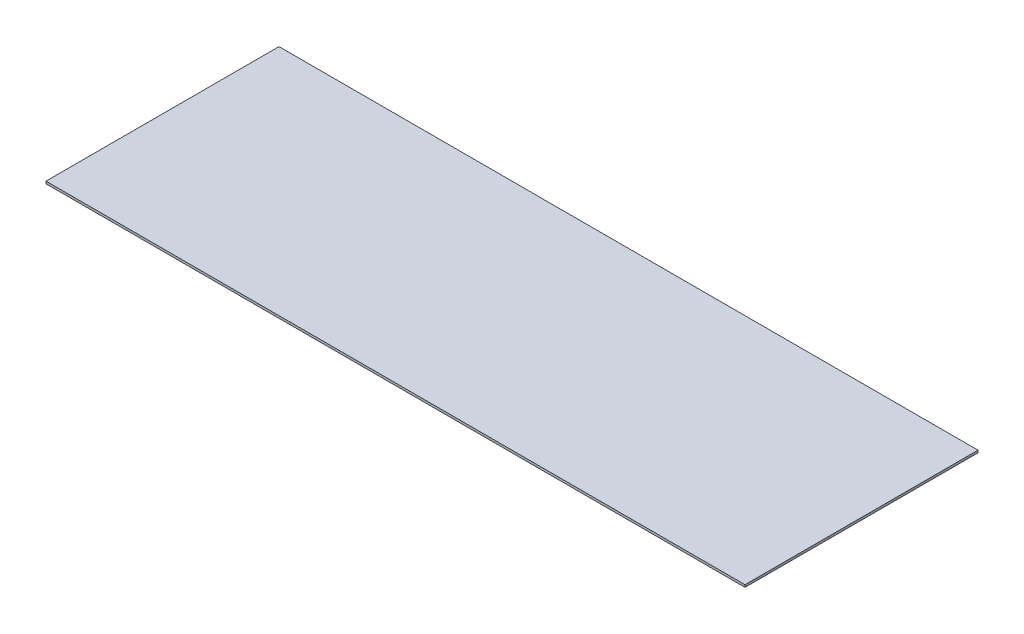
ISO-10303-21;
HEADER;
FILE_DESCRIPTION(('STEP AP214'),'2;1');
FILE_NAME('part.step','',(''),(''),'','','');
FILE_SCHEMA(('AUTOMOTIVE_DESIGN { 1 0 10303 214 1 1 1 1 }'));
ENDSEC;
DATA;
#1=APPLICATION_CONTEXT('core data for automotive mechanical design processes');
#2=APPLICATION_PROTOCOL_DEFINITION('international standard','automotive_design',2000,#1);
#3=PRODUCT_CONTEXT('',#1,'mechanical');
#4=PRODUCT('Part','Part','',(#3));
#5=PRODUCT_RELATED_PRODUCT_CATEGORY('part','',(#4));
#6=PRODUCT_DEFINITION_FORMATION('','',#4);
#7=PRODUCT_DEFINITION_CONTEXT('part definition',#1,'design');
#8=PRODUCT_DEFINITION('design','',#6,#7);
#9=PRODUCT_DEFINITION_SHAPE('','',#8);
#10=(LENGTH_UNIT() NAMED_UNIT(*) SI_UNIT(.MILLI.,.METRE.));
#11=(NAMED_UNIT(*) PLANE_ANGLE_UNIT() SI_UNIT($,.RADIAN.));
#12=(NAMED_UNIT(*) SI_UNIT($,.STERADIAN.) SOLID_ANGLE_UNIT());
#13=UNCERTAINTY_MEASURE_WITH_UNIT(LENGTH_MEASURE(1.E-05),#10,'distance_accuracy_value','');
#14=(GEOMETRIC_REPRESENTATION_CONTEXT(3) GLOBAL_UNCERTAINTY_ASSIGNED_CONTEXT((#13)) GLOBAL_UNIT_ASSIGNED_CONTEXT((#10,
#11,#12)) REPRESENTATION_CONTEXT('',''));
#15=CARTESIAN_POINT('',(0.,0.,0.));
#16=DIRECTION('',(0.,0.,1.));
#17=DIRECTION('',(1.,0.,0.));
#18=AXIS2_PLACEMENT_3D('',#15,#16,#17);
#19=CARTESIAN_POINT('',(0.,1.,0.));
#20=DIRECTION('',(1.,0.,0.));
#21=DIRECTION('',(0.,0.,-1.));
#22=AXIS2_PLACEMENT_3D('',#19,#20,#21);
#23=PLANE('',#22);
#24=DIRECTION('',(0.,0.,1.));
#25=VECTOR('',#24,1.);
#26=CARTESIAN_POINT('',(0.,0.,0.));
#27=LINE('',#26,#25);
#28=CARTESIAN_POINT('',(0.,0.,-100.));
#29=VERTEX_POINT('',#28);
#30=CARTESIAN_POINT('',(0.,0.,0.));
#31=VERTEX_POINT('',#30);
#32=EDGE_CURVE('E94',#29,#31,#27,.T.);
#33=ORIENTED_EDGE('',*,*,#32,.T.);
#34=DIRECTION('',(0.,-1.,0.));
#35=VECTOR('',#34,1.);
#36=CARTESIAN_POINT('',(0.,1.,0.));
#37=LINE('',#36,#35);
#38=CARTESIAN_POINT('',(0.,1.,0.));
#39=VERTEX_POINT('',#38);
#40=EDGE_CURVE('E11',#39,#31,#37,.T.);
#41=ORIENTED_EDGE('',*,*,#40,.F.);
#42=DIRECTION('',(0.,0.,1.));
#43=VECTOR('',#42,1.);
#44=CARTESIAN_POINT('',(0.,1.,0.));
#45=LINE('',#44,#43);
#46=CARTESIAN_POINT('',(0.,1.,-100.));
#47=VERTEX_POINT('',#46);
#48=EDGE_CURVE('E82',#47,#39,#45,.T.);
#49=ORIENTED_EDGE('',*,*,#48,.F.);
#50=DIRECTION('',(0.,-1.,0.));
#51=VECTOR('',#50,1.);
#52=CARTESIAN_POINT('',(0.,1.,-100.));
#53=LINE('',#52,#51);
#54=EDGE_CURVE('E90',#47,#29,#53,.T.);
#55=ORIENTED_EDGE('',*,*,#54,.T.);
#56=EDGE_LOOP('',(#33,#41,#49,#55));
#57=FACE_BOUND('',#56,.T.);
#58=ADVANCED_FACE('F31',(#57),#23,.F.);
#59=CARTESIAN_POINT('',(0.,1.,0.));
#60=DIRECTION('',(0.,0.,-1.));
#61=DIRECTION('',(-1.,0.,0.));
#62=AXIS2_PLACEMENT_3D('',#59,#60,#61);
#63=PLANE('',#62);
#64=DIRECTION('',(1.,0.,0.));
#65=VECTOR('',#64,1.);
#66=CARTESIAN_POINT('',(0.,0.,0.));
#67=LINE('',#66,#65);
#68=CARTESIAN_POINT('',(300.,0.,0.));
#69=VERTEX_POINT('',#68);
#70=EDGE_CURVE('E86',#31,#69,#67,.T.);
#71=ORIENTED_EDGE('',*,*,#70,.T.);
#72=DIRECTION('',(0.,-1.,0.));
#73=VECTOR('',#72,1.);
#74=CARTESIAN_POINT('',(300.,1.,0.));
#75=LINE('',#74,#73);
#76=CARTESIAN_POINT('',(300.,1.,0.));
#77=VERTEX_POINT('',#76);
#78=EDGE_CURVE('E39',#77,#69,#75,.T.);
#79=ORIENTED_EDGE('',*,*,#78,.F.);
#80=DIRECTION('',(1.,0.,0.));
#81=VECTOR('',#80,1.);
#82=CARTESIAN_POINT('',(0.,1.,0.));
#83=LINE('',#82,#81);
#84=EDGE_CURVE('E77',#39,#77,#83,.T.);
#85=ORIENTED_EDGE('',*,*,#84,.F.);
#86=ORIENTED_EDGE('',*,*,#40,.T.);
#87=EDGE_LOOP('',(#71,#79,#85,#86));
#88=FACE_BOUND('',#87,.T.);
#89=ADVANCED_FACE('F85',(#88),#63,.F.);
#90=CARTESIAN_POINT('',(300.,1.,0.));
#91=DIRECTION('',(-1.,0.,0.));
#92=DIRECTION('',(0.,0.,1.));
#93=AXIS2_PLACEMENT_3D('',#90,#91,#92);
#94=PLANE('',#93);
#95=DIRECTION('',(0.,0.,-1.));
#96=VECTOR('',#95,1.);
#97=CARTESIAN_POINT('',(300.,0.,0.));
#98=LINE('',#97,#96);
#99=CARTESIAN_POINT('',(300.,0.,-100.));
#100=VERTEX_POINT('',#99);
#101=EDGE_CURVE('E64',#69,#100,#98,.T.);
#102=ORIENTED_EDGE('',*,*,#101,.T.);
#103=DIRECTION('',(0.,-1.,0.));
#104=VECTOR('',#103,1.);
#105=CARTESIAN_POINT('',(300.,1.,-100.));
#106=LINE('',#105,#104);
#107=CARTESIAN_POINT('',(300.,1.,-100.));
#108=VERTEX_POINT('',#107);
#109=EDGE_CURVE('E87',#108,#100,#106,.T.);
#110=ORIENTED_EDGE('',*,*,#109,.F.);
#111=DIRECTION('',(0.,0.,-1.));
#112=VECTOR('',#111,1.);
#113=CARTESIAN_POINT('',(300.,1.,0.));
#114=LINE('',#113,#112);
#115=EDGE_CURVE('E80',#77,#108,#114,.T.);
#116=ORIENTED_EDGE('',*,*,#115,.F.);
#117=ORIENTED_EDGE('',*,*,#78,.T.);
#118=EDGE_LOOP('',(#102,#110,#116,#117));
#119=FACE_BOUND('',#118,.T.);
#120=ADVANCED_FACE('F88',(#119),#94,.F.);
#121=CARTESIAN_POINT('',(0.,1.,-100.));
#122=DIRECTION('',(0.,0.,1.));
#123=DIRECTION('',(1.,0.,0.));
#124=AXIS2_PLACEMENT_3D('',#121,#122,#123);
#125=PLANE('',#124);
#126=DIRECTION('',(-1.,0.,0.));
#127=VECTOR('',#126,1.);
#128=CARTESIAN_POINT('',(0.,0.,-100.));
#129=LINE('',#128,#127);
#130=EDGE_CURVE('E70',#100,#29,#129,.T.);
#131=ORIENTED_EDGE('',*,*,#130,.T.);
#132=ORIENTED_EDGE('',*,*,#54,.F.);
#133=DIRECTION('',(-1.,0.,0.));
#134=VECTOR('',#133,1.);
#135=CARTESIAN_POINT('',(0.,1.,-100.));
#136=LINE('',#135,#134);
#137=EDGE_CURVE('E47',#108,#47,#136,.T.);
#138=ORIENTED_EDGE('',*,*,#137,.F.);
#139=ORIENTED_EDGE('',*,*,#109,.T.);
#140=EDGE_LOOP('',(#131,#132,#138,#139));
#141=FACE_BOUND('',#140,.T.);
#142=ADVANCED_FACE('F101',(#141),#125,.F.);
#143=CARTESIAN_POINT('',(0.,1.,-100.));
#144=DIRECTION('',(0.,-1.,0.));
#145=DIRECTION('',(0.,0.,-1.));
#146=AXIS2_PLACEMENT_3D('',#143,#144,#145);
#147=PLANE('',#146);
#148=ORIENTED_EDGE('',*,*,#48,.T.);
#149=ORIENTED_EDGE('',*,*,#84,.T.);
#150=ORIENTED_EDGE('',*,*,#115,.T.);
#151=ORIENTED_EDGE('',*,*,#137,.T.);
#152=EDGE_LOOP('',(#148,#149,#150,#151));
#153=FACE_BOUND('',#152,.T.);
#154=ADVANCED_FACE('F78',(#153),#147,.F.);
#155=CARTESIAN_POINT('',(0.,0.,-100.));
#156=DIRECTION('',(0.,-1.,0.));
#157=DIRECTION('',(0.,0.,-1.));
#158=AXIS2_PLACEMENT_3D('',#155,#156,#157);
#159=PLANE('',#158);
#160=ORIENTED_EDGE('',*,*,#32,.F.);
#161=ORIENTED_EDGE('',*,*,#130,.F.);
#162=ORIENTED_EDGE('',*,*,#101,.F.);
#163=ORIENTED_EDGE('',*,*,#70,.F.);
#164=EDGE_LOOP('',(#160,#161,#162,#163));
#165=FACE_BOUND('',#164,.T.);
#166=ADVANCED_FACE('F104',(#165),#159,.T.);
#167=CLOSED_SHELL('',(#58,#89,#120,#142,#154,#166));
#168=MANIFOLD_SOLID_BREP('B2',#167);
#169=ADVANCED_BREP_SHAPE_REPRESENTATION('',(#18,#168),#14);
#170=SHAPE_DEFINITION_REPRESENTATION(#9,#169);
ENDSEC;
END-ISO-10303-21;
